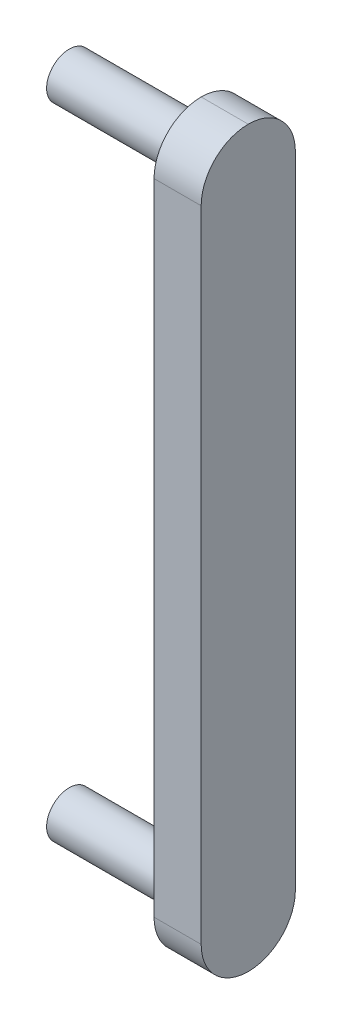
ISO-10303-21;
HEADER;
FILE_DESCRIPTION(('STEP AP214'),'2;1');
FILE_NAME('part.step','',(''),(''),'','','');
FILE_SCHEMA(('AUTOMOTIVE_DESIGN { 1 0 10303 214 1 1 1 1 }'));
ENDSEC;
DATA;
#1=APPLICATION_CONTEXT('core data for automotive mechanical design processes');
#2=APPLICATION_PROTOCOL_DEFINITION('international standard','automotive_design',2000,#1);
#3=PRODUCT_CONTEXT('',#1,'mechanical');
#4=PRODUCT('Part','Part','',(#3));
#5=PRODUCT_RELATED_PRODUCT_CATEGORY('part','',(#4));
#6=PRODUCT_DEFINITION_FORMATION('','',#4);
#7=PRODUCT_DEFINITION_CONTEXT('part definition',#1,'design');
#8=PRODUCT_DEFINITION('design','',#6,#7);
#9=PRODUCT_DEFINITION_SHAPE('','',#8);
#10=(LENGTH_UNIT() NAMED_UNIT(*) SI_UNIT(.MILLI.,.METRE.));
#11=(NAMED_UNIT(*) PLANE_ANGLE_UNIT() SI_UNIT($,.RADIAN.));
#12=(NAMED_UNIT(*) SI_UNIT($,.STERADIAN.) SOLID_ANGLE_UNIT());
#13=UNCERTAINTY_MEASURE_WITH_UNIT(LENGTH_MEASURE(1.E-05),#10,'distance_accuracy_value','');
#14=(GEOMETRIC_REPRESENTATION_CONTEXT(3) GLOBAL_UNCERTAINTY_ASSIGNED_CONTEXT((#13)) GLOBAL_UNIT_ASSIGNED_CONTEXT((#10,
#11,#12)) REPRESENTATION_CONTEXT('',''));
#15=CARTESIAN_POINT('',(0.,0.,0.));
#16=DIRECTION('',(0.,0.,1.));
#17=DIRECTION('',(1.,0.,0.));
#18=AXIS2_PLACEMENT_3D('',#15,#16,#17);
#19=CARTESIAN_POINT('',(3.175,-24.7269,3.175));
#20=DIRECTION('',(0.,0.,-1.));
#21=DIRECTION('',(-1.,0.,0.));
#22=AXIS2_PLACEMENT_3D('',#19,#20,#21);
#23=PLANE('',#22);
#24=DIRECTION('',(0.,-1.,0.));
#25=VECTOR('',#24,1.);
#26=CARTESIAN_POINT('',(0.,-24.7269,3.175));
#27=LINE('',#26,#25);
#28=CARTESIAN_POINT('',(0.,21.5519,3.175));
#29=VERTEX_POINT('',#28);
#30=CARTESIAN_POINT('',(0.,-21.5519,3.175));
#31=VERTEX_POINT('',#30);
#32=EDGE_CURVE('E91',#29,#31,#27,.T.);
#33=ORIENTED_EDGE('',*,*,#32,.T.);
#34=DIRECTION('',(-1.,0.,0.));
#35=VECTOR('',#34,1.);
#36=CARTESIAN_POINT('',(3.175,-21.5519,3.175));
#37=LINE('',#36,#35);
#38=CARTESIAN_POINT('',(3.175,-21.5519,3.175));
#39=VERTEX_POINT('',#38);
#40=EDGE_CURVE('E97',#31,#39,#37,.F.);
#41=ORIENTED_EDGE('',*,*,#40,.T.);
#42=DIRECTION('',(0.,-1.,0.));
#43=VECTOR('',#42,1.);
#44=CARTESIAN_POINT('',(3.175,-24.7269,3.175));
#45=LINE('',#44,#43);
#46=CARTESIAN_POINT('',(3.175,21.5519,3.175));
#47=VERTEX_POINT('',#46);
#48=EDGE_CURVE('E94',#47,#39,#45,.T.);
#49=ORIENTED_EDGE('',*,*,#48,.F.);
#50=DIRECTION('',(-1.,0.,0.));
#51=VECTOR('',#50,1.);
#52=CARTESIAN_POINT('',(3.175,21.5519,3.175));
#53=LINE('',#52,#51);
#54=EDGE_CURVE('E88',#47,#29,#53,.T.);
#55=ORIENTED_EDGE('',*,*,#54,.T.);
#56=EDGE_LOOP('',(#33,#41,#49,#55));
#57=FACE_BOUND('',#56,.T.);
#58=ADVANCED_FACE('F33',(#57),#23,.F.);
#59=CARTESIAN_POINT('',(3.175,-24.7269,-3.175));
#60=DIRECTION('',(0.,0.,1.));
#61=DIRECTION('',(1.,0.,0.));
#62=AXIS2_PLACEMENT_3D('',#59,#60,#61);
#63=PLANE('',#62);
#64=DIRECTION('',(0.,1.,0.));
#65=VECTOR('',#64,1.);
#66=CARTESIAN_POINT('',(3.175,-24.7269,-3.175));
#67=LINE('',#66,#65);
#68=CARTESIAN_POINT('',(3.175,-21.5519,-3.175));
#69=VERTEX_POINT('',#68);
#70=CARTESIAN_POINT('',(3.175,21.5519,-3.175));
#71=VERTEX_POINT('',#70);
#72=EDGE_CURVE('E145',#69,#71,#67,.T.);
#73=ORIENTED_EDGE('',*,*,#72,.F.);
#74=DIRECTION('',(-1.,0.,0.));
#75=VECTOR('',#74,1.);
#76=CARTESIAN_POINT('',(3.175,-21.5519,-3.175));
#77=LINE('',#76,#75);
#78=CARTESIAN_POINT('',(0.,-21.5519,-3.175));
#79=VERTEX_POINT('',#78);
#80=EDGE_CURVE('E11',#69,#79,#77,.T.);
#81=ORIENTED_EDGE('',*,*,#80,.T.);
#82=DIRECTION('',(0.,1.,0.));
#83=VECTOR('',#82,1.);
#84=CARTESIAN_POINT('',(0.,-24.7269,-3.175));
#85=LINE('',#84,#83);
#86=CARTESIAN_POINT('',(0.,21.5519,-3.175));
#87=VERTEX_POINT('',#86);
#88=EDGE_CURVE('E105',#79,#87,#85,.T.);
#89=ORIENTED_EDGE('',*,*,#88,.T.);
#90=DIRECTION('',(-1.,0.,0.));
#91=VECTOR('',#90,1.);
#92=CARTESIAN_POINT('',(3.175,21.5519,-3.175));
#93=LINE('',#92,#91);
#94=EDGE_CURVE('E42',#87,#71,#93,.F.);
#95=ORIENTED_EDGE('',*,*,#94,.T.);
#96=EDGE_LOOP('',(#73,#81,#89,#95));
#97=FACE_BOUND('',#96,.T.);
#98=ADVANCED_FACE('F142',(#97),#63,.F.);
#99=CARTESIAN_POINT('',(3.175,0.,0.));
#100=DIRECTION('',(1.,0.,0.));
#101=DIRECTION('',(0.,0.,-1.));
#102=AXIS2_PLACEMENT_3D('',#99,#100,#101);
#103=PLANE('',#102);
#104=ORIENTED_EDGE('',*,*,#48,.T.);
#105=CARTESIAN_POINT('',(3.175,-21.5519,0.));
#106=DIRECTION('',(1.,0.,0.));
#107=DIRECTION('',(0.,0.,-1.));
#108=AXIS2_PLACEMENT_3D('',#105,#106,#107);
#109=CIRCLE('',#108,3.175);
#110=CARTESIAN_POINT('',(3.175,-24.7269,0.));
#111=VERTEX_POINT('',#110);
#112=EDGE_CURVE('E127',#39,#111,#109,.T.);
#113=ORIENTED_EDGE('',*,*,#112,.T.);
#114=CARTESIAN_POINT('',(3.175,-21.5519,0.));
#115=DIRECTION('',(1.,0.,0.));
#116=DIRECTION('',(0.,0.,-1.));
#117=AXIS2_PLACEMENT_3D('',#114,#115,#116);
#118=CIRCLE('',#117,3.175);
#119=EDGE_CURVE('E125',#111,#69,#118,.T.);
#120=ORIENTED_EDGE('',*,*,#119,.T.);
#121=ORIENTED_EDGE('',*,*,#72,.T.);
#122=CARTESIAN_POINT('',(3.175,21.5519,0.));
#123=DIRECTION('',(1.,0.,0.));
#124=DIRECTION('',(0.,0.,-1.));
#125=AXIS2_PLACEMENT_3D('',#122,#123,#124);
#126=CIRCLE('',#125,3.175);
#127=CARTESIAN_POINT('',(3.175,24.7269,0.));
#128=VERTEX_POINT('',#127);
#129=EDGE_CURVE('E50',#71,#128,#126,.T.);
#130=ORIENTED_EDGE('',*,*,#129,.T.);
#131=CARTESIAN_POINT('',(3.175,21.5519,0.));
#132=DIRECTION('',(1.,0.,0.));
#133=DIRECTION('',(0.,0.,-1.));
#134=AXIS2_PLACEMENT_3D('',#131,#132,#133);
#135=CIRCLE('',#134,3.175);
#136=EDGE_CURVE('E122',#128,#47,#135,.T.);
#137=ORIENTED_EDGE('',*,*,#136,.T.);
#138=EDGE_LOOP('',(#104,#113,#120,#121,#130,#137));
#139=FACE_BOUND('',#138,.T.);
#140=ADVANCED_FACE('F166',(#139),#103,.T.);
#141=CARTESIAN_POINT('',(0.,0.,0.));
#142=DIRECTION('',(1.,0.,0.));
#143=DIRECTION('',(0.,0.,-1.));
#144=AXIS2_PLACEMENT_3D('',#141,#142,#143);
#145=PLANE('',#144);
#146=CARTESIAN_POINT('',(0.,-21.5519,0.));
#147=DIRECTION('',(1.,0.,0.));
#148=DIRECTION('',(0.,0.,-1.));
#149=AXIS2_PLACEMENT_3D('',#146,#147,#148);
#150=CIRCLE('',#149,1.524);
#151=CARTESIAN_POINT('',(0.,-21.5519,-1.524));
#152=VERTEX_POINT('',#151);
#153=EDGE_CURVE('E110',#152,#152,#150,.F.);
#154=ORIENTED_EDGE('',*,*,#153,.F.);
#155=EDGE_LOOP('',(#154));
#156=FACE_BOUND('',#155,.T.);
#157=CARTESIAN_POINT('',(0.,21.5519,0.));
#158=DIRECTION('',(1.,0.,0.));
#159=DIRECTION('',(0.,0.,-1.));
#160=AXIS2_PLACEMENT_3D('',#157,#158,#159);
#161=CIRCLE('',#160,1.524);
#162=CARTESIAN_POINT('',(0.,21.5519,-1.524));
#163=VERTEX_POINT('',#162);
#164=EDGE_CURVE('E115',#163,#163,#161,.F.);
#165=ORIENTED_EDGE('',*,*,#164,.F.);
#166=EDGE_LOOP('',(#165));
#167=FACE_BOUND('',#166,.T.);
#168=CARTESIAN_POINT('',(0.,-21.5519,0.));
#169=DIRECTION('',(1.,0.,0.));
#170=DIRECTION('',(0.,0.,-1.));
#171=AXIS2_PLACEMENT_3D('',#168,#169,#170);
#172=CIRCLE('',#171,3.175);
#173=CARTESIAN_POINT('',(0.,-24.7269,0.));
#174=VERTEX_POINT('',#173);
#175=EDGE_CURVE('E112',#79,#174,#172,.F.);
#176=ORIENTED_EDGE('',*,*,#175,.T.);
#177=CARTESIAN_POINT('',(0.,-21.5519,0.));
#178=DIRECTION('',(1.,0.,0.));
#179=DIRECTION('',(0.,0.,-1.));
#180=AXIS2_PLACEMENT_3D('',#177,#178,#179);
#181=CIRCLE('',#180,3.175);
#182=EDGE_CURVE('E98',#174,#31,#181,.F.);
#183=ORIENTED_EDGE('',*,*,#182,.T.);
#184=ORIENTED_EDGE('',*,*,#32,.F.);
#185=CARTESIAN_POINT('',(0.,21.5519,0.));
#186=DIRECTION('',(1.,0.,0.));
#187=DIRECTION('',(0.,0.,-1.));
#188=AXIS2_PLACEMENT_3D('',#185,#186,#187);
#189=CIRCLE('',#188,3.175);
#190=CARTESIAN_POINT('',(0.,24.7269,0.));
#191=VERTEX_POINT('',#190);
#192=EDGE_CURVE('E102',#29,#191,#189,.F.);
#193=ORIENTED_EDGE('',*,*,#192,.T.);
#194=CARTESIAN_POINT('',(0.,21.5519,0.));
#195=DIRECTION('',(1.,0.,0.));
#196=DIRECTION('',(0.,0.,-1.));
#197=AXIS2_PLACEMENT_3D('',#194,#195,#196);
#198=CIRCLE('',#197,3.175);
#199=EDGE_CURVE('E109',#191,#87,#198,.F.);
#200=ORIENTED_EDGE('',*,*,#199,.T.);
#201=ORIENTED_EDGE('',*,*,#88,.F.);
#202=EDGE_LOOP('',(#176,#183,#184,#193,#200,#201));
#203=FACE_BOUND('',#202,.T.);
#204=ADVANCED_FACE('F101',(#156,#167,#203),#145,.F.);
#205=CARTESIAN_POINT('',(-8.89,21.5519,0.));
#206=DIRECTION('',(1.,0.,0.));
#207=DIRECTION('',(0.,0.,-1.));
#208=AXIS2_PLACEMENT_3D('',#205,#206,#207);
#209=CYLINDRICAL_SURFACE('',#208,1.524);
#210=CARTESIAN_POINT('',(-8.89,21.5519,0.));
#211=DIRECTION('',(-1.,0.,0.));
#212=DIRECTION('',(0.,0.,1.));
#213=AXIS2_PLACEMENT_3D('',#210,#211,#212);
#214=CIRCLE('',#213,1.524);
#215=CARTESIAN_POINT('',(-8.89,21.5519,1.524));
#216=VERTEX_POINT('',#215);
#217=EDGE_CURVE('E106',#216,#216,#214,.T.);
#218=ORIENTED_EDGE('',*,*,#217,.F.);
#219=EDGE_LOOP('',(#218));
#220=FACE_BOUND('',#219,.T.);
#221=ORIENTED_EDGE('',*,*,#164,.T.);
#222=EDGE_LOOP('',(#221));
#223=FACE_BOUND('',#222,.T.);
#224=ADVANCED_FACE('F157',(#220,#223),#209,.T.);
#225=CARTESIAN_POINT('',(-8.89,21.5519,0.));
#226=DIRECTION('',(-1.,0.,0.));
#227=DIRECTION('',(0.,0.,1.));
#228=AXIS2_PLACEMENT_3D('',#225,#226,#227);
#229=PLANE('',#228);
#230=ORIENTED_EDGE('',*,*,#217,.T.);
#231=EDGE_LOOP('',(#230));
#232=FACE_BOUND('',#231,.T.);
#233=ADVANCED_FACE('F155',(#232),#229,.T.);
#234=CARTESIAN_POINT('',(-8.89,-21.5519,0.));
#235=DIRECTION('',(1.,0.,0.));
#236=DIRECTION('',(0.,0.,-1.));
#237=AXIS2_PLACEMENT_3D('',#234,#235,#236);
#238=CYLINDRICAL_SURFACE('',#237,1.524);
#239=CARTESIAN_POINT('',(-8.89,-21.5519,0.));
#240=DIRECTION('',(-1.,0.,0.));
#241=DIRECTION('',(0.,0.,1.));
#242=AXIS2_PLACEMENT_3D('',#239,#240,#241);
#243=CIRCLE('',#242,1.524);
#244=CARTESIAN_POINT('',(-8.89,-21.5519,1.524));
#245=VERTEX_POINT('',#244);
#246=EDGE_CURVE('E131',#245,#245,#243,.T.);
#247=ORIENTED_EDGE('',*,*,#246,.F.);
#248=EDGE_LOOP('',(#247));
#249=FACE_BOUND('',#248,.T.);
#250=ORIENTED_EDGE('',*,*,#153,.T.);
#251=EDGE_LOOP('',(#250));
#252=FACE_BOUND('',#251,.T.);
#253=ADVANCED_FACE('F164',(#249,#252),#238,.T.);
#254=CARTESIAN_POINT('',(-8.89,-21.5519,0.));
#255=DIRECTION('',(-1.,0.,0.));
#256=DIRECTION('',(0.,0.,1.));
#257=AXIS2_PLACEMENT_3D('',#254,#255,#256);
#258=PLANE('',#257);
#259=ORIENTED_EDGE('',*,*,#246,.T.);
#260=EDGE_LOOP('',(#259));
#261=FACE_BOUND('',#260,.T.);
#262=ADVANCED_FACE('F182',(#261),#258,.T.);
#263=CARTESIAN_POINT('',(3.175,-21.5519,0.));
#264=DIRECTION('',(-1.,0.,0.));
#265=DIRECTION('',(0.,0.,1.));
#266=AXIS2_PLACEMENT_3D('',#263,#264,#265);
#267=CYLINDRICAL_SURFACE('',#266,3.175);
#268=ORIENTED_EDGE('',*,*,#80,.F.);
#269=ORIENTED_EDGE('',*,*,#119,.F.);
#270=DIRECTION('',(-1.,0.,0.));
#271=VECTOR('',#270,1.);
#272=CARTESIAN_POINT('',(3.175,-24.7269,0.));
#273=LINE('',#272,#271);
#274=EDGE_CURVE('E129',#174,#111,#273,.F.);
#275=ORIENTED_EDGE('',*,*,#274,.F.);
#276=ORIENTED_EDGE('',*,*,#175,.F.);
#277=EDGE_LOOP('',(#268,#269,#275,#276));
#278=FACE_BOUND('',#277,.T.);
#279=ADVANCED_FACE('F180',(#278),#267,.T.);
#280=CARTESIAN_POINT('',(3.175,-21.5519,0.));
#281=DIRECTION('',(-1.,0.,0.));
#282=DIRECTION('',(0.,0.,1.));
#283=AXIS2_PLACEMENT_3D('',#280,#281,#282);
#284=CYLINDRICAL_SURFACE('',#283,3.175);
#285=ORIENTED_EDGE('',*,*,#112,.F.);
#286=ORIENTED_EDGE('',*,*,#40,.F.);
#287=ORIENTED_EDGE('',*,*,#182,.F.);
#288=ORIENTED_EDGE('',*,*,#274,.T.);
#289=EDGE_LOOP('',(#285,#286,#287,#288));
#290=FACE_BOUND('',#289,.T.);
#291=ADVANCED_FACE('F177',(#290),#284,.T.);
#292=CARTESIAN_POINT('',(3.175,21.5519,0.));
#293=DIRECTION('',(-1.,0.,0.));
#294=DIRECTION('',(0.,0.,1.));
#295=AXIS2_PLACEMENT_3D('',#292,#293,#294);
#296=CYLINDRICAL_SURFACE('',#295,3.175);
#297=ORIENTED_EDGE('',*,*,#54,.F.);
#298=ORIENTED_EDGE('',*,*,#136,.F.);
#299=DIRECTION('',(-1.,0.,0.));
#300=VECTOR('',#299,1.);
#301=CARTESIAN_POINT('',(3.175,24.7269,0.));
#302=LINE('',#301,#300);
#303=EDGE_CURVE('E37',#191,#128,#302,.F.);
#304=ORIENTED_EDGE('',*,*,#303,.F.);
#305=ORIENTED_EDGE('',*,*,#192,.F.);
#306=EDGE_LOOP('',(#297,#298,#304,#305));
#307=FACE_BOUND('',#306,.T.);
#308=ADVANCED_FACE('F35',(#307),#296,.T.);
#309=CARTESIAN_POINT('',(3.175,21.5519,0.));
#310=DIRECTION('',(-1.,0.,0.));
#311=DIRECTION('',(0.,0.,1.));
#312=AXIS2_PLACEMENT_3D('',#309,#310,#311);
#313=CYLINDRICAL_SURFACE('',#312,3.175);
#314=ORIENTED_EDGE('',*,*,#129,.F.);
#315=ORIENTED_EDGE('',*,*,#94,.F.);
#316=ORIENTED_EDGE('',*,*,#199,.F.);
#317=ORIENTED_EDGE('',*,*,#303,.T.);
#318=EDGE_LOOP('',(#314,#315,#316,#317));
#319=FACE_BOUND('',#318,.T.);
#320=ADVANCED_FACE('F136',(#319),#313,.T.);
#321=CLOSED_SHELL('',(#58,#98,#140,#204,#224,#233,#253,#262,#279,#291,#308,#320));
#322=MANIFOLD_SOLID_BREP('B2',#321);
#323=ADVANCED_BREP_SHAPE_REPRESENTATION('',(#18,#322),#14);
#324=SHAPE_DEFINITION_REPRESENTATION(#9,#323);
ENDSEC;
END-ISO-10303-21;
